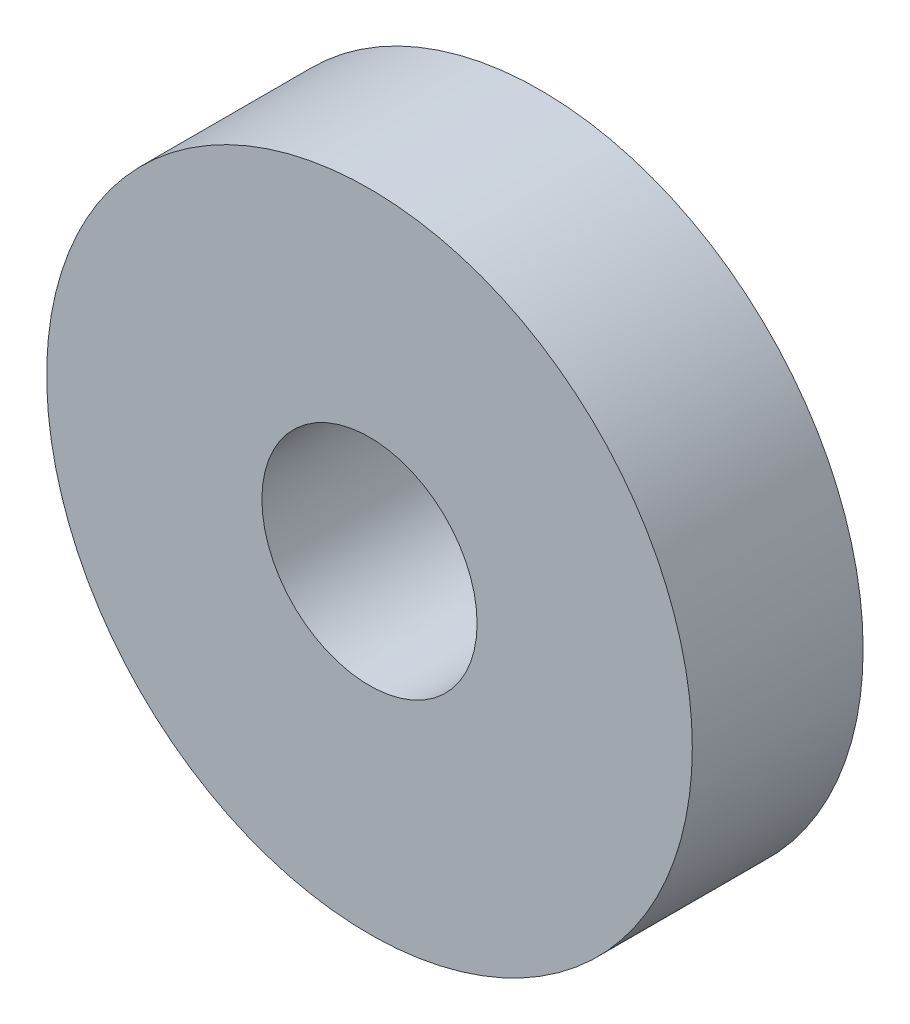
ISO-10303-21;
HEADER;
FILE_DESCRIPTION(('STEP AP214'),'2;1');
FILE_NAME('part.step','',(''),(''),'','','');
FILE_SCHEMA(('AUTOMOTIVE_DESIGN { 1 0 10303 214 1 1 1 1 }'));
ENDSEC;
DATA;
#1=APPLICATION_CONTEXT('core data for automotive mechanical design processes');
#2=APPLICATION_PROTOCOL_DEFINITION('international standard','automotive_design',2000,#1);
#3=PRODUCT_CONTEXT('',#1,'mechanical');
#4=PRODUCT('Part','Part','',(#3));
#5=PRODUCT_RELATED_PRODUCT_CATEGORY('part','',(#4));
#6=PRODUCT_DEFINITION_FORMATION('','',#4);
#7=PRODUCT_DEFINITION_CONTEXT('part definition',#1,'design');
#8=PRODUCT_DEFINITION('design','',#6,#7);
#9=PRODUCT_DEFINITION_SHAPE('','',#8);
#10=(LENGTH_UNIT() NAMED_UNIT(*) SI_UNIT(.MILLI.,.METRE.));
#11=(NAMED_UNIT(*) PLANE_ANGLE_UNIT() SI_UNIT($,.RADIAN.));
#12=(NAMED_UNIT(*) SI_UNIT($,.STERADIAN.) SOLID_ANGLE_UNIT());
#13=UNCERTAINTY_MEASURE_WITH_UNIT(LENGTH_MEASURE(1.E-05),#10,'distance_accuracy_value','');
#14=(GEOMETRIC_REPRESENTATION_CONTEXT(3) GLOBAL_UNCERTAINTY_ASSIGNED_CONTEXT((#13)) GLOBAL_UNIT_ASSIGNED_CONTEXT((#10,
#11,#12)) REPRESENTATION_CONTEXT('',''));
#15=CARTESIAN_POINT('',(0.,0.,0.));
#16=DIRECTION('',(0.,0.,1.));
#17=DIRECTION('',(1.,0.,0.));
#18=AXIS2_PLACEMENT_3D('',#15,#16,#17);
#19=CARTESIAN_POINT('',(0.,0.,3.175));
#20=DIRECTION('',(0.,0.,1.));
#21=DIRECTION('',(1.,0.,0.));
#22=AXIS2_PLACEMENT_3D('',#19,#20,#21);
#23=PLANE('',#22);
#24=CARTESIAN_POINT('',(0.,0.,3.175));
#25=DIRECTION('',(0.,0.,1.));
#26=DIRECTION('',(1.,0.,0.));
#27=AXIS2_PLACEMENT_3D('',#24,#25,#26);
#28=CIRCLE('',#27,6.);
#29=CARTESIAN_POINT('',(6.,0.,3.175));
#30=VERTEX_POINT('',#29);
#31=EDGE_CURVE('E10',#30,#30,#28,.T.);
#32=ORIENTED_EDGE('',*,*,#31,.T.);
#33=EDGE_LOOP('',(#32));
#34=FACE_BOUND('',#33,.T.);
#35=CARTESIAN_POINT('',(0.,0.,3.175));
#36=DIRECTION('',(0.,0.,1.));
#37=DIRECTION('',(1.,0.,0.));
#38=AXIS2_PLACEMENT_3D('',#35,#36,#37);
#39=CIRCLE('',#38,2.);
#40=CARTESIAN_POINT('',(2.,0.,3.175));
#41=VERTEX_POINT('',#40);
#42=EDGE_CURVE('E42',#41,#41,#39,.T.);
#43=ORIENTED_EDGE('',*,*,#42,.F.);
#44=EDGE_LOOP('',(#43));
#45=FACE_BOUND('',#44,.T.);
#46=ADVANCED_FACE('F31',(#34,#45),#23,.T.);
#47=CARTESIAN_POINT('',(0.,0.,0.));
#48=DIRECTION('',(0.,0.,1.));
#49=DIRECTION('',(1.,0.,0.));
#50=AXIS2_PLACEMENT_3D('',#47,#48,#49);
#51=PLANE('',#50);
#52=CARTESIAN_POINT('',(0.,0.,0.));
#53=DIRECTION('',(0.,0.,1.));
#54=DIRECTION('',(1.,0.,0.));
#55=AXIS2_PLACEMENT_3D('',#52,#53,#54);
#56=CIRCLE('',#55,6.);
#57=CARTESIAN_POINT('',(6.,0.,0.));
#58=VERTEX_POINT('',#57);
#59=EDGE_CURVE('E35',#58,#58,#56,.T.);
#60=ORIENTED_EDGE('',*,*,#59,.F.);
#61=EDGE_LOOP('',(#60));
#62=FACE_BOUND('',#61,.T.);
#63=CARTESIAN_POINT('',(0.,0.,0.));
#64=DIRECTION('',(0.,0.,1.));
#65=DIRECTION('',(1.,0.,0.));
#66=AXIS2_PLACEMENT_3D('',#63,#64,#65);
#67=CIRCLE('',#66,2.);
#68=CARTESIAN_POINT('',(2.,0.,0.));
#69=VERTEX_POINT('',#68);
#70=EDGE_CURVE('E44',#69,#69,#67,.T.);
#71=ORIENTED_EDGE('',*,*,#70,.T.);
#72=EDGE_LOOP('',(#71));
#73=FACE_BOUND('',#72,.T.);
#74=ADVANCED_FACE('F54',(#62,#73),#51,.F.);
#75=CARTESIAN_POINT('',(0.,0.,3.175));
#76=DIRECTION('',(0.,0.,-1.));
#77=DIRECTION('',(-1.,0.,0.));
#78=AXIS2_PLACEMENT_3D('',#75,#76,#77);
#79=CYLINDRICAL_SURFACE('',#78,6.);
#80=ORIENTED_EDGE('',*,*,#31,.F.);
#81=EDGE_LOOP('',(#80));
#82=FACE_BOUND('',#81,.T.);
#83=ORIENTED_EDGE('',*,*,#59,.T.);
#84=EDGE_LOOP('',(#83));
#85=FACE_BOUND('',#84,.T.);
#86=ADVANCED_FACE('F33',(#82,#85),#79,.T.);
#87=CARTESIAN_POINT('',(0.,0.,3.175));
#88=DIRECTION('',(0.,0.,-1.));
#89=DIRECTION('',(-1.,0.,0.));
#90=AXIS2_PLACEMENT_3D('',#87,#88,#89);
#91=CYLINDRICAL_SURFACE('',#90,2.);
#92=ORIENTED_EDGE('',*,*,#42,.T.);
#93=EDGE_LOOP('',(#92));
#94=FACE_BOUND('',#93,.T.);
#95=ORIENTED_EDGE('',*,*,#70,.F.);
#96=EDGE_LOOP('',(#95));
#97=FACE_BOUND('',#96,.T.);
#98=ADVANCED_FACE('F50',(#94,#97),#91,.F.);
#99=CLOSED_SHELL('',(#46,#74,#86,#98));
#100=MANIFOLD_SOLID_BREP('B2',#99);
#101=ADVANCED_BREP_SHAPE_REPRESENTATION('',(#18,#100),#14);
#102=SHAPE_DEFINITION_REPRESENTATION(#9,#101);
ENDSEC;
END-ISO-10303-21;
